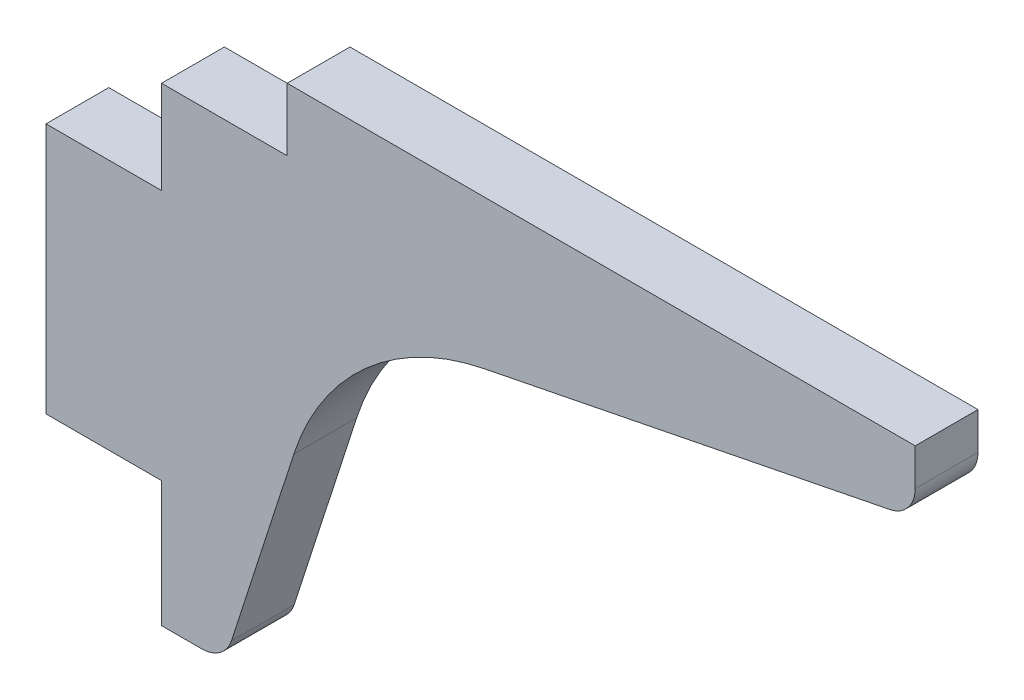
ISO-10303-21;
HEADER;
FILE_DESCRIPTION(('STEP AP214'),'2;1');
FILE_NAME('part.step','',(''),(''),'','','');
FILE_SCHEMA(('AUTOMOTIVE_DESIGN { 1 0 10303 214 1 1 1 1 }'));
ENDSEC;
DATA;
#1=APPLICATION_CONTEXT('core data for automotive mechanical design processes');
#2=APPLICATION_PROTOCOL_DEFINITION('international standard','automotive_design',2000,#1);
#3=PRODUCT_CONTEXT('',#1,'mechanical');
#4=PRODUCT('Part','Part','',(#3));
#5=PRODUCT_RELATED_PRODUCT_CATEGORY('part','',(#4));
#6=PRODUCT_DEFINITION_FORMATION('','',#4);
#7=PRODUCT_DEFINITION_CONTEXT('part definition',#1,'design');
#8=PRODUCT_DEFINITION('design','',#6,#7);
#9=PRODUCT_DEFINITION_SHAPE('','',#8);
#10=(LENGTH_UNIT() NAMED_UNIT(*) SI_UNIT(.MILLI.,.METRE.));
#11=(NAMED_UNIT(*) PLANE_ANGLE_UNIT() SI_UNIT($,.RADIAN.));
#12=(NAMED_UNIT(*) SI_UNIT($,.STERADIAN.) SOLID_ANGLE_UNIT());
#13=UNCERTAINTY_MEASURE_WITH_UNIT(LENGTH_MEASURE(1.E-05),#10,'distance_accuracy_value','');
#14=(GEOMETRIC_REPRESENTATION_CONTEXT(3) GLOBAL_UNCERTAINTY_ASSIGNED_CONTEXT((#13)) GLOBAL_UNIT_ASSIGNED_CONTEXT((#10,
#11,#12)) REPRESENTATION_CONTEXT('',''));
#15=CARTESIAN_POINT('',(0.,0.,0.));
#16=DIRECTION('',(0.,0.,1.));
#17=DIRECTION('',(1.,0.,0.));
#18=AXIS2_PLACEMENT_3D('',#15,#16,#17);
#19=CARTESIAN_POINT('',(-2.921,-6.35,3.175));
#20=DIRECTION('',(1.,0.,0.));
#21=DIRECTION('',(0.,0.,-1.));
#22=AXIS2_PLACEMENT_3D('',#19,#20,#21);
#23=PLANE('',#22);
#24=DIRECTION('',(0.,-1.,0.));
#25=VECTOR('',#24,1.);
#26=CARTESIAN_POINT('',(-2.921,-6.35,0.));
#27=LINE('',#26,#25);
#28=CARTESIAN_POINT('',(-2.921,6.35,0.));
#29=VERTEX_POINT('',#28);
#30=CARTESIAN_POINT('',(-2.921,-6.35,0.));
#31=VERTEX_POINT('',#30);
#32=EDGE_CURVE('E165',#29,#31,#27,.T.);
#33=ORIENTED_EDGE('',*,*,#32,.T.);
#34=DIRECTION('',(0.,0.,-1.));
#35=VECTOR('',#34,1.);
#36=CARTESIAN_POINT('',(-2.921,-6.35,3.175));
#37=LINE('',#36,#35);
#38=CARTESIAN_POINT('',(-2.921,-6.35,3.175));
#39=VERTEX_POINT('',#38);
#40=EDGE_CURVE('E146',#39,#31,#37,.T.);
#41=ORIENTED_EDGE('',*,*,#40,.F.);
#42=DIRECTION('',(0.,-1.,0.));
#43=VECTOR('',#42,1.);
#44=CARTESIAN_POINT('',(-2.921,-6.35,3.175));
#45=LINE('',#44,#43);
#46=CARTESIAN_POINT('',(-2.921,6.35,3.175));
#47=VERTEX_POINT('',#46);
#48=EDGE_CURVE('E152',#47,#39,#45,.T.);
#49=ORIENTED_EDGE('',*,*,#48,.F.);
#50=DIRECTION('',(0.,0.,-1.));
#51=VECTOR('',#50,1.);
#52=CARTESIAN_POINT('',(-2.921,6.35,3.175));
#53=LINE('',#52,#51);
#54=EDGE_CURVE('E227',#47,#29,#53,.T.);
#55=ORIENTED_EDGE('',*,*,#54,.T.);
#56=EDGE_LOOP('',(#33,#41,#49,#55));
#57=FACE_BOUND('',#56,.T.);
#58=ADVANCED_FACE('F35',(#57),#23,.F.);
#59=CARTESIAN_POINT('',(2.921,-6.35,3.175));
#60=DIRECTION('',(0.,1.,0.));
#61=DIRECTION('',(-1.,0.,0.));
#62=AXIS2_PLACEMENT_3D('',#59,#60,#61);
#63=PLANE('',#62);
#64=DIRECTION('',(1.,0.,0.));
#65=VECTOR('',#64,1.);
#66=CARTESIAN_POINT('',(2.921,-6.35,0.));
#67=LINE('',#66,#65);
#68=CARTESIAN_POINT('',(2.921,-6.35,0.));
#69=VERTEX_POINT('',#68);
#70=EDGE_CURVE('E249',#31,#69,#67,.T.);
#71=ORIENTED_EDGE('',*,*,#70,.T.);
#72=DIRECTION('',(0.,0.,-1.));
#73=VECTOR('',#72,1.);
#74=CARTESIAN_POINT('',(2.921,-6.35,3.175));
#75=LINE('',#74,#73);
#76=CARTESIAN_POINT('',(2.921,-6.35,3.175));
#77=VERTEX_POINT('',#76);
#78=EDGE_CURVE('E149',#77,#69,#75,.T.);
#79=ORIENTED_EDGE('',*,*,#78,.F.);
#80=DIRECTION('',(1.,0.,0.));
#81=VECTOR('',#80,1.);
#82=CARTESIAN_POINT('',(2.921,-6.35,3.175));
#83=LINE('',#82,#81);
#84=EDGE_CURVE('E142',#39,#77,#83,.T.);
#85=ORIENTED_EDGE('',*,*,#84,.F.);
#86=ORIENTED_EDGE('',*,*,#40,.T.);
#87=EDGE_LOOP('',(#71,#79,#85,#86));
#88=FACE_BOUND('',#87,.T.);
#89=ADVANCED_FACE('F144',(#88),#63,.F.);
#90=CARTESIAN_POINT('',(2.921,-6.35,3.175));
#91=DIRECTION('',(1.,0.,0.));
#92=DIRECTION('',(0.,1.,0.));
#93=AXIS2_PLACEMENT_3D('',#90,#91,#92);
#94=PLANE('',#93);
#95=DIRECTION('',(0.,-1.,0.));
#96=VECTOR('',#95,1.);
#97=CARTESIAN_POINT('',(2.921,-6.35,0.));
#98=LINE('',#97,#96);
#99=CARTESIAN_POINT('',(2.921,-12.7,0.));
#100=VERTEX_POINT('',#99);
#101=EDGE_CURVE('E213',#69,#100,#98,.T.);
#102=ORIENTED_EDGE('',*,*,#101,.T.);
#103=DIRECTION('',(0.,0.,-1.));
#104=VECTOR('',#103,1.);
#105=CARTESIAN_POINT('',(2.921,-12.7,3.175));
#106=LINE('',#105,#104);
#107=CARTESIAN_POINT('',(2.921,-12.7,3.175));
#108=VERTEX_POINT('',#107);
#109=EDGE_CURVE('E171',#108,#100,#106,.T.);
#110=ORIENTED_EDGE('',*,*,#109,.F.);
#111=DIRECTION('',(0.,-1.,0.));
#112=VECTOR('',#111,1.);
#113=CARTESIAN_POINT('',(2.921,-6.35,3.175));
#114=LINE('',#113,#112);
#115=EDGE_CURVE('E151',#77,#108,#114,.T.);
#116=ORIENTED_EDGE('',*,*,#115,.F.);
#117=ORIENTED_EDGE('',*,*,#78,.T.);
#118=EDGE_LOOP('',(#102,#110,#116,#117));
#119=FACE_BOUND('',#118,.T.);
#120=ADVANCED_FACE('F268',(#119),#94,.F.);
#121=CARTESIAN_POINT('',(2.921,-12.7,3.175));
#122=DIRECTION('',(0.,1.,0.));
#123=DIRECTION('',(0.,0.,1.));
#124=AXIS2_PLACEMENT_3D('',#121,#122,#123);
#125=PLANE('',#124);
#126=DIRECTION('',(1.,0.,0.));
#127=VECTOR('',#126,1.);
#128=CARTESIAN_POINT('',(2.921,-12.7,0.));
#129=LINE('',#128,#127);
#130=CARTESIAN_POINT('',(4.94108290707324,-12.7,0.));
#131=VERTEX_POINT('',#130);
#132=EDGE_CURVE('E208',#100,#131,#129,.T.);
#133=ORIENTED_EDGE('',*,*,#132,.T.);
#134=DIRECTION('',(0.,0.,-1.));
#135=VECTOR('',#134,1.);
#136=CARTESIAN_POINT('',(4.94108290707324,-12.7,3.175));
#137=LINE('',#136,#135);
#138=CARTESIAN_POINT('',(4.94108290707324,-12.7,3.175));
#139=VERTEX_POINT('',#138);
#140=EDGE_CURVE('E11',#131,#139,#137,.F.);
#141=ORIENTED_EDGE('',*,*,#140,.T.);
#142=DIRECTION('',(1.,0.,0.));
#143=VECTOR('',#142,1.);
#144=CARTESIAN_POINT('',(2.921,-12.7,3.175));
#145=LINE('',#144,#143);
#146=EDGE_CURVE('E246',#108,#139,#145,.T.);
#147=ORIENTED_EDGE('',*,*,#146,.F.);
#148=ORIENTED_EDGE('',*,*,#109,.T.);
#149=EDGE_LOOP('',(#133,#141,#147,#148));
#150=FACE_BOUND('',#149,.T.);
#151=ADVANCED_FACE('F245',(#150),#125,.F.);
#152=CARTESIAN_POINT('',(6.096,-12.7,3.175));
#153=DIRECTION('',(-0.95144564878436,0.307816791954739,0.));
#154=DIRECTION('',(-0.307816791954739,-0.95144564878436,0.));
#155=AXIS2_PLACEMENT_3D('',#152,#153,#154);
#156=PLANE('',#155);
#157=DIRECTION('',(0.30781679195474,0.951445648784361,0.));
#158=VECTOR('',#157,1.);
#159=CARTESIAN_POINT('',(6.096,-12.7,3.175));
#160=LINE('',#159,#158);
#161=CARTESIAN_POINT('',(6.45150287451841,-11.6011591572281,3.175));
#162=VERTEX_POINT('',#161);
#163=CARTESIAN_POINT('',(9.60780333701404,-1.84519905437877,3.175));
#164=VERTEX_POINT('',#163);
#165=EDGE_CURVE('E199',#162,#164,#160,.T.);
#166=ORIENTED_EDGE('',*,*,#165,.F.);
#167=DIRECTION('',(0.,0.,-1.));
#168=VECTOR('',#167,1.);
#169=CARTESIAN_POINT('',(6.45150287451841,-11.6011591572281,3.175));
#170=LINE('',#169,#168);
#171=CARTESIAN_POINT('',(6.45150287451841,-11.6011591572281,0.));
#172=VERTEX_POINT('',#171);
#173=EDGE_CURVE('E43',#162,#172,#170,.T.);
#174=ORIENTED_EDGE('',*,*,#173,.T.);
#175=DIRECTION('',(0.30781679195474,0.951445648784361,0.));
#176=VECTOR('',#175,1.);
#177=CARTESIAN_POINT('',(6.096,-12.7,0.));
#178=LINE('',#177,#176);
#179=CARTESIAN_POINT('',(9.60780333701404,-1.84519905437877,0.));
#180=VERTEX_POINT('',#179);
#181=EDGE_CURVE('E198',#172,#180,#178,.T.);
#182=ORIENTED_EDGE('',*,*,#181,.T.);
#183=DIRECTION('',(0.,0.,-1.));
#184=VECTOR('',#183,1.);
#185=CARTESIAN_POINT('',(9.60780333701404,-1.84519905437877,3.175));
#186=LINE('',#185,#184);
#187=EDGE_CURVE('E169',#180,#164,#186,.F.);
#188=ORIENTED_EDGE('',*,*,#187,.T.);
#189=EDGE_LOOP('',(#166,#174,#182,#188));
#190=FACE_BOUND('',#189,.T.);
#191=ADVANCED_FACE('F197',(#190),#156,.F.);
#192=CARTESIAN_POINT('',(11.9012561210691,5.2437438789308,3.175));
#193=DIRECTION('',(-0.195510775075919,0.980701553393903,0.));
#194=DIRECTION('',(-0.980701553393903,-0.195510775075919,0.));
#195=AXIS2_PLACEMENT_3D('',#192,#193,#194);
#196=PLANE('',#195);
#197=DIRECTION('',(0.980701553393903,0.195510775075919,0.));
#198=VECTOR('',#197,1.);
#199=CARTESIAN_POINT('',(11.9012561210691,5.2437438789308,0.));
#200=LINE('',#199,#198);
#201=CARTESIAN_POINT('',(19.2081762331112,6.7004374158986,0.));
#202=VERTEX_POINT('',#201);
#203=CARTESIAN_POINT('',(39.743873355433,10.7943944889908,0.));
#204=VERTEX_POINT('',#203);
#205=EDGE_CURVE('E207',#202,#204,#200,.T.);
#206=ORIENTED_EDGE('',*,*,#205,.T.);
#207=DIRECTION('',(0.,0.,-1.));
#208=VECTOR('',#207,1.);
#209=CARTESIAN_POINT('',(39.743873355433,10.7943944889908,3.175));
#210=LINE('',#209,#208);
#211=CARTESIAN_POINT('',(39.743873355433,10.7943944889908,3.175));
#212=VERTEX_POINT('',#211);
#213=EDGE_CURVE('E189',#204,#212,#210,.F.);
#214=ORIENTED_EDGE('',*,*,#213,.T.);
#215=DIRECTION('',(0.980701553393903,0.195510775075919,0.));
#216=VECTOR('',#215,1.);
#217=CARTESIAN_POINT('',(11.9012561210691,5.2437438789308,3.175));
#218=LINE('',#217,#216);
#219=CARTESIAN_POINT('',(19.2081762331112,6.7004374158986,3.175));
#220=VERTEX_POINT('',#219);
#221=EDGE_CURVE('E264',#220,#212,#218,.T.);
#222=ORIENTED_EDGE('',*,*,#221,.F.);
#223=DIRECTION('',(0.,0.,-1.));
#224=VECTOR('',#223,1.);
#225=CARTESIAN_POINT('',(19.2081762331112,6.7004374158986,0.));
#226=LINE('',#225,#224);
#227=EDGE_CURVE('E166',#220,#202,#226,.T.);
#228=ORIENTED_EDGE('',*,*,#227,.T.);
#229=EDGE_LOOP('',(#206,#214,#222,#228));
#230=FACE_BOUND('',#229,.T.);
#231=ADVANCED_FACE('F323',(#230),#196,.F.);
#232=CARTESIAN_POINT('',(41.021,14.224,3.175));
#233=DIRECTION('',(-1.,0.,0.));
#234=DIRECTION('',(0.,0.,1.));
#235=AXIS2_PLACEMENT_3D('',#232,#233,#234);
#236=PLANE('',#235);
#237=DIRECTION('',(0.,1.,0.));
#238=VECTOR('',#237,1.);
#239=CARTESIAN_POINT('',(41.021,14.224,3.175));
#240=LINE('',#239,#238);
#241=CARTESIAN_POINT('',(41.021,12.3512582050036,3.175));
#242=VERTEX_POINT('',#241);
#243=CARTESIAN_POINT('',(41.021,14.224,3.175));
#244=VERTEX_POINT('',#243);
#245=EDGE_CURVE('E262',#242,#244,#240,.T.);
#246=ORIENTED_EDGE('',*,*,#245,.F.);
#247=DIRECTION('',(0.,0.,-1.));
#248=VECTOR('',#247,1.);
#249=CARTESIAN_POINT('',(41.021,12.3512582050036,3.175));
#250=LINE('',#249,#248);
#251=CARTESIAN_POINT('',(41.021,12.3512582050036,0.));
#252=VERTEX_POINT('',#251);
#253=EDGE_CURVE('E182',#242,#252,#250,.T.);
#254=ORIENTED_EDGE('',*,*,#253,.T.);
#255=DIRECTION('',(0.,1.,0.));
#256=VECTOR('',#255,1.);
#257=CARTESIAN_POINT('',(41.021,14.224,0.));
#258=LINE('',#257,#256);
#259=CARTESIAN_POINT('',(41.021,14.224,0.));
#260=VERTEX_POINT('',#259);
#261=EDGE_CURVE('E211',#252,#260,#258,.T.);
#262=ORIENTED_EDGE('',*,*,#261,.T.);
#263=DIRECTION('',(0.,0.,-1.));
#264=VECTOR('',#263,1.);
#265=CARTESIAN_POINT('',(41.021,14.224,3.175));
#266=LINE('',#265,#264);
#267=EDGE_CURVE('E241',#244,#260,#266,.T.);
#268=ORIENTED_EDGE('',*,*,#267,.F.);
#269=EDGE_LOOP('',(#246,#254,#262,#268));
#270=FACE_BOUND('',#269,.T.);
#271=ADVANCED_FACE('F298',(#270),#236,.F.);
#272=CARTESIAN_POINT('',(9.271,14.224,3.175));
#273=DIRECTION('',(0.,-1.,0.));
#274=DIRECTION('',(0.,0.,-1.));
#275=AXIS2_PLACEMENT_3D('',#272,#273,#274);
#276=PLANE('',#275);
#277=DIRECTION('',(-1.,0.,0.));
#278=VECTOR('',#277,1.);
#279=CARTESIAN_POINT('',(9.271,14.224,0.));
#280=LINE('',#279,#278);
#281=CARTESIAN_POINT('',(9.271,14.224,0.));
#282=VERTEX_POINT('',#281);
#283=EDGE_CURVE('E218',#260,#282,#280,.T.);
#284=ORIENTED_EDGE('',*,*,#283,.T.);
#285=DIRECTION('',(0.,0.,-1.));
#286=VECTOR('',#285,1.);
#287=CARTESIAN_POINT('',(9.271,14.224,3.175));
#288=LINE('',#287,#286);
#289=CARTESIAN_POINT('',(9.271,14.224,3.175));
#290=VERTEX_POINT('',#289);
#291=EDGE_CURVE('E238',#290,#282,#288,.T.);
#292=ORIENTED_EDGE('',*,*,#291,.F.);
#293=DIRECTION('',(-1.,0.,0.));
#294=VECTOR('',#293,1.);
#295=CARTESIAN_POINT('',(9.271,14.224,3.175));
#296=LINE('',#295,#294);
#297=EDGE_CURVE('E260',#244,#290,#296,.T.);
#298=ORIENTED_EDGE('',*,*,#297,.F.);
#299=ORIENTED_EDGE('',*,*,#267,.T.);
#300=EDGE_LOOP('',(#284,#292,#298,#299));
#301=FACE_BOUND('',#300,.T.);
#302=ADVANCED_FACE('F303',(#301),#276,.F.);
#303=CARTESIAN_POINT('',(9.271,14.224,3.175));
#304=DIRECTION('',(1.,0.,0.));
#305=DIRECTION('',(0.,0.,-1.));
#306=AXIS2_PLACEMENT_3D('',#303,#304,#305);
#307=PLANE('',#306);
#308=DIRECTION('',(0.,-1.,0.));
#309=VECTOR('',#308,1.);
#310=CARTESIAN_POINT('',(9.271,14.224,0.));
#311=LINE('',#310,#309);
#312=CARTESIAN_POINT('',(9.271,11.049,0.));
#313=VERTEX_POINT('',#312);
#314=EDGE_CURVE('E220',#282,#313,#311,.T.);
#315=ORIENTED_EDGE('',*,*,#314,.T.);
#316=DIRECTION('',(0.,0.,-1.));
#317=VECTOR('',#316,1.);
#318=CARTESIAN_POINT('',(9.271,11.049,3.175));
#319=LINE('',#318,#317);
#320=CARTESIAN_POINT('',(9.271,11.049,3.175));
#321=VERTEX_POINT('',#320);
#322=EDGE_CURVE('E235',#321,#313,#319,.T.);
#323=ORIENTED_EDGE('',*,*,#322,.F.);
#324=DIRECTION('',(0.,-1.,0.));
#325=VECTOR('',#324,1.);
#326=CARTESIAN_POINT('',(9.271,14.224,3.175));
#327=LINE('',#326,#325);
#328=EDGE_CURVE('E258',#290,#321,#327,.T.);
#329=ORIENTED_EDGE('',*,*,#328,.F.);
#330=ORIENTED_EDGE('',*,*,#291,.T.);
#331=EDGE_LOOP('',(#315,#323,#329,#330));
#332=FACE_BOUND('',#331,.T.);
#333=ADVANCED_FACE('F309',(#332),#307,.F.);
#334=CARTESIAN_POINT('',(2.921,11.049,3.175));
#335=DIRECTION('',(0.,-1.,0.));
#336=DIRECTION('',(0.,0.,-1.));
#337=AXIS2_PLACEMENT_3D('',#334,#335,#336);
#338=PLANE('',#337);
#339=DIRECTION('',(-1.,0.,0.));
#340=VECTOR('',#339,1.);
#341=CARTESIAN_POINT('',(2.921,11.049,0.));
#342=LINE('',#341,#340);
#343=CARTESIAN_POINT('',(2.921,11.049,0.));
#344=VERTEX_POINT('',#343);
#345=EDGE_CURVE('E222',#313,#344,#342,.T.);
#346=ORIENTED_EDGE('',*,*,#345,.T.);
#347=DIRECTION('',(0.,0.,-1.));
#348=VECTOR('',#347,1.);
#349=CARTESIAN_POINT('',(2.921,11.049,3.175));
#350=LINE('',#349,#348);
#351=CARTESIAN_POINT('',(2.921,11.049,3.175));
#352=VERTEX_POINT('',#351);
#353=EDGE_CURVE('E232',#352,#344,#350,.T.);
#354=ORIENTED_EDGE('',*,*,#353,.F.);
#355=DIRECTION('',(-1.,0.,0.));
#356=VECTOR('',#355,1.);
#357=CARTESIAN_POINT('',(2.921,11.049,3.175));
#358=LINE('',#357,#356);
#359=EDGE_CURVE('E256',#321,#352,#358,.T.);
#360=ORIENTED_EDGE('',*,*,#359,.F.);
#361=ORIENTED_EDGE('',*,*,#322,.T.);
#362=EDGE_LOOP('',(#346,#354,#360,#361));
#363=FACE_BOUND('',#362,.T.);
#364=ADVANCED_FACE('F313',(#363),#338,.F.);
#365=CARTESIAN_POINT('',(2.921,6.35,3.175));
#366=DIRECTION('',(1.,0.,0.));
#367=DIRECTION('',(0.,1.,0.));
#368=AXIS2_PLACEMENT_3D('',#365,#366,#367);
#369=PLANE('',#368);
#370=DIRECTION('',(0.,-1.,0.));
#371=VECTOR('',#370,1.);
#372=CARTESIAN_POINT('',(2.921,6.35,0.));
#373=LINE('',#372,#371);
#374=CARTESIAN_POINT('',(2.921,6.35,0.));
#375=VERTEX_POINT('',#374);
#376=EDGE_CURVE('E224',#344,#375,#373,.T.);
#377=ORIENTED_EDGE('',*,*,#376,.T.);
#378=DIRECTION('',(0.,0.,-1.));
#379=VECTOR('',#378,1.);
#380=CARTESIAN_POINT('',(2.921,6.35,3.175));
#381=LINE('',#380,#379);
#382=CARTESIAN_POINT('',(2.921,6.35,3.175));
#383=VERTEX_POINT('',#382);
#384=EDGE_CURVE('E229',#383,#375,#381,.T.);
#385=ORIENTED_EDGE('',*,*,#384,.F.);
#386=DIRECTION('',(0.,-1.,0.));
#387=VECTOR('',#386,1.);
#388=CARTESIAN_POINT('',(2.921,6.35,3.175));
#389=LINE('',#388,#387);
#390=EDGE_CURVE('E254',#352,#383,#389,.T.);
#391=ORIENTED_EDGE('',*,*,#390,.F.);
#392=ORIENTED_EDGE('',*,*,#353,.T.);
#393=EDGE_LOOP('',(#377,#385,#391,#392));
#394=FACE_BOUND('',#393,.T.);
#395=ADVANCED_FACE('F318',(#394),#369,.F.);
#396=CARTESIAN_POINT('',(2.921,6.35,3.175));
#397=DIRECTION('',(0.,-1.,0.));
#398=DIRECTION('',(1.,0.,0.));
#399=AXIS2_PLACEMENT_3D('',#396,#397,#398);
#400=PLANE('',#399);
#401=DIRECTION('',(-1.,0.,0.));
#402=VECTOR('',#401,1.);
#403=CARTESIAN_POINT('',(2.921,6.35,0.));
#404=LINE('',#403,#402);
#405=EDGE_CURVE('E162',#375,#29,#404,.T.);
#406=ORIENTED_EDGE('',*,*,#405,.T.);
#407=ORIENTED_EDGE('',*,*,#54,.F.);
#408=DIRECTION('',(-1.,0.,0.));
#409=VECTOR('',#408,1.);
#410=CARTESIAN_POINT('',(2.921,6.35,3.175));
#411=LINE('',#410,#409);
#412=EDGE_CURVE('E158',#383,#47,#411,.T.);
#413=ORIENTED_EDGE('',*,*,#412,.F.);
#414=ORIENTED_EDGE('',*,*,#384,.T.);
#415=EDGE_LOOP('',(#406,#407,#413,#414));
#416=FACE_BOUND('',#415,.T.);
#417=ADVANCED_FACE('F321',(#416),#400,.F.);
#418=CARTESIAN_POINT('',(0.,0.,3.175));
#419=DIRECTION('',(0.,0.,1.));
#420=DIRECTION('',(1.,0.,0.));
#421=AXIS2_PLACEMENT_3D('',#418,#419,#420);
#422=PLANE('',#421);
#423=ORIENTED_EDGE('',*,*,#221,.T.);
#424=CARTESIAN_POINT('',(39.4335,12.3512582050036,3.175));
#425=DIRECTION('',(0.,0.,1.));
#426=DIRECTION('',(1.,0.,0.));
#427=AXIS2_PLACEMENT_3D('',#424,#425,#426);
#428=CIRCLE('',#427,1.5875);
#429=EDGE_CURVE('E192',#212,#242,#428,.T.);
#430=ORIENTED_EDGE('',*,*,#429,.T.);
#431=ORIENTED_EDGE('',*,*,#245,.T.);
#432=ORIENTED_EDGE('',*,*,#297,.T.);
#433=ORIENTED_EDGE('',*,*,#328,.T.);
#434=ORIENTED_EDGE('',*,*,#359,.T.);
#435=ORIENTED_EDGE('',*,*,#390,.T.);
#436=ORIENTED_EDGE('',*,*,#412,.T.);
#437=ORIENTED_EDGE('',*,*,#48,.T.);
#438=ORIENTED_EDGE('',*,*,#84,.T.);
#439=ORIENTED_EDGE('',*,*,#115,.T.);
#440=ORIENTED_EDGE('',*,*,#146,.T.);
#441=CARTESIAN_POINT('',(4.94108290707324,-11.1125,3.175));
#442=DIRECTION('',(0.,0.,1.));
#443=DIRECTION('',(1.,0.,0.));
#444=AXIS2_PLACEMENT_3D('',#441,#442,#443);
#445=CIRCLE('',#444,1.5875);
#446=EDGE_CURVE('E50',#139,#162,#445,.T.);
#447=ORIENTED_EDGE('',*,*,#446,.T.);
#448=ORIENTED_EDGE('',*,*,#165,.T.);
#449=CARTESIAN_POINT('',(21.6911630765754,-5.75447231220396,3.175));
#450=DIRECTION('',(0.,0.,1.));
#451=DIRECTION('',(1.,0.,0.));
#452=AXIS2_PLACEMENT_3D('',#449,#450,#451);
#453=CIRCLE('',#452,12.7);
#454=EDGE_CURVE('E180',#164,#220,#453,.F.);
#455=ORIENTED_EDGE('',*,*,#454,.T.);
#456=EDGE_LOOP('',(#423,#430,#431,#432,#433,#434,#435,#436,#437,#438,#439,#440,#447,#448,#455));
#457=FACE_BOUND('',#456,.T.);
#458=ADVANCED_FACE('F156',(#457),#422,.T.);
#459=CARTESIAN_POINT('',(0.,0.,0.));
#460=DIRECTION('',(0.,0.,1.));
#461=DIRECTION('',(1.,0.,0.));
#462=AXIS2_PLACEMENT_3D('',#459,#460,#461);
#463=PLANE('',#462);
#464=ORIENTED_EDGE('',*,*,#261,.F.);
#465=CARTESIAN_POINT('',(39.4335,12.3512582050036,0.));
#466=DIRECTION('',(0.,0.,1.));
#467=DIRECTION('',(1.,0.,0.));
#468=AXIS2_PLACEMENT_3D('',#465,#466,#467);
#469=CIRCLE('',#468,1.5875);
#470=EDGE_CURVE('E187',#252,#204,#469,.F.);
#471=ORIENTED_EDGE('',*,*,#470,.T.);
#472=ORIENTED_EDGE('',*,*,#205,.F.);
#473=CARTESIAN_POINT('',(21.6911630765754,-5.75447231220396,0.));
#474=DIRECTION('',(0.,0.,1.));
#475=DIRECTION('',(1.,0.,0.));
#476=AXIS2_PLACEMENT_3D('',#473,#474,#475);
#477=CIRCLE('',#476,12.7);
#478=EDGE_CURVE('E177',#202,#180,#477,.T.);
#479=ORIENTED_EDGE('',*,*,#478,.T.);
#480=ORIENTED_EDGE('',*,*,#181,.F.);
#481=CARTESIAN_POINT('',(4.94108290707324,-11.1125,0.));
#482=DIRECTION('',(0.,0.,1.));
#483=DIRECTION('',(1.,0.,0.));
#484=AXIS2_PLACEMENT_3D('',#481,#482,#483);
#485=CIRCLE('',#484,1.5875);
#486=EDGE_CURVE('E185',#172,#131,#485,.F.);
#487=ORIENTED_EDGE('',*,*,#486,.T.);
#488=ORIENTED_EDGE('',*,*,#132,.F.);
#489=ORIENTED_EDGE('',*,*,#101,.F.);
#490=ORIENTED_EDGE('',*,*,#70,.F.);
#491=ORIENTED_EDGE('',*,*,#32,.F.);
#492=ORIENTED_EDGE('',*,*,#405,.F.);
#493=ORIENTED_EDGE('',*,*,#376,.F.);
#494=ORIENTED_EDGE('',*,*,#345,.F.);
#495=ORIENTED_EDGE('',*,*,#314,.F.);
#496=ORIENTED_EDGE('',*,*,#283,.F.);
#497=EDGE_LOOP('',(#464,#471,#472,#479,#480,#487,#488,#489,#490,#491,#492,#493,#494,#495,#496));
#498=FACE_BOUND('',#497,.T.);
#499=ADVANCED_FACE('F203',(#498),#463,.F.);
#500=CARTESIAN_POINT('',(21.6911630765754,-5.75447231220396,3.175));
#501=DIRECTION('',(0.,0.,1.));
#502=DIRECTION('',(1.,0.,0.));
#503=AXIS2_PLACEMENT_3D('',#500,#501,#502);
#504=CYLINDRICAL_SURFACE('',#503,12.7);
#505=ORIENTED_EDGE('',*,*,#454,.F.);
#506=ORIENTED_EDGE('',*,*,#187,.F.);
#507=ORIENTED_EDGE('',*,*,#478,.F.);
#508=ORIENTED_EDGE('',*,*,#227,.F.);
#509=EDGE_LOOP('',(#505,#506,#507,#508));
#510=FACE_BOUND('',#509,.T.);
#511=ADVANCED_FACE('F282',(#510),#504,.F.);
#512=CARTESIAN_POINT('',(39.4335,12.3512582050036,3.175));
#513=DIRECTION('',(0.,0.,-1.));
#514=DIRECTION('',(-1.,0.,0.));
#515=AXIS2_PLACEMENT_3D('',#512,#513,#514);
#516=CYLINDRICAL_SURFACE('',#515,1.5875);
#517=ORIENTED_EDGE('',*,*,#429,.F.);
#518=ORIENTED_EDGE('',*,*,#213,.F.);
#519=ORIENTED_EDGE('',*,*,#470,.F.);
#520=ORIENTED_EDGE('',*,*,#253,.F.);
#521=EDGE_LOOP('',(#517,#518,#519,#520));
#522=FACE_BOUND('',#521,.T.);
#523=ADVANCED_FACE('F284',(#522),#516,.T.);
#524=CARTESIAN_POINT('',(4.94108290707324,-11.1125,3.175));
#525=DIRECTION('',(0.,0.,-1.));
#526=DIRECTION('',(-1.,0.,0.));
#527=AXIS2_PLACEMENT_3D('',#524,#525,#526);
#528=CYLINDRICAL_SURFACE('',#527,1.5875);
#529=ORIENTED_EDGE('',*,*,#446,.F.);
#530=ORIENTED_EDGE('',*,*,#140,.F.);
#531=ORIENTED_EDGE('',*,*,#486,.F.);
#532=ORIENTED_EDGE('',*,*,#173,.F.);
#533=EDGE_LOOP('',(#529,#530,#531,#532));
#534=FACE_BOUND('',#533,.T.);
#535=ADVANCED_FACE('F37',(#534),#528,.T.);
#536=CLOSED_SHELL('',(#58,#89,#120,#151,#191,#231,#271,#302,#333,#364,#395,#417,#458,#499,#511,
#523,#535));
#537=MANIFOLD_SOLID_BREP('B2',#536);
#538=ADVANCED_BREP_SHAPE_REPRESENTATION('',(#18,#537),#14);
#539=SHAPE_DEFINITION_REPRESENTATION(#9,#538);
ENDSEC;
END-ISO-10303-21;
